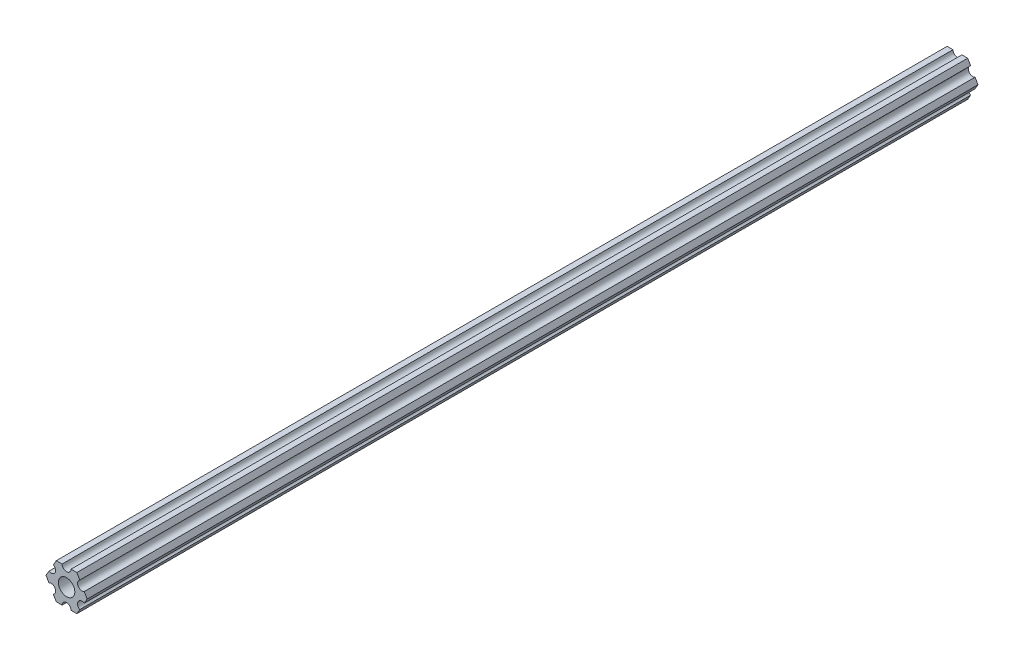
ISO-10303-21;
HEADER;
FILE_DESCRIPTION(('STEP AP214'),'2;1');
FILE_NAME('part.step','',(''),(''),'','','');
FILE_SCHEMA(('AUTOMOTIVE_DESIGN { 1 0 10303 214 1 1 1 1 }'));
ENDSEC;
DATA;
#1=APPLICATION_CONTEXT('core data for automotive mechanical design processes');
#2=APPLICATION_PROTOCOL_DEFINITION('international standard','automotive_design',2000,#1);
#3=PRODUCT_CONTEXT('',#1,'mechanical');
#4=PRODUCT('Part','Part','',(#3));
#5=PRODUCT_RELATED_PRODUCT_CATEGORY('part','',(#4));
#6=PRODUCT_DEFINITION_FORMATION('','',#4);
#7=PRODUCT_DEFINITION_CONTEXT('part definition',#1,'design');
#8=PRODUCT_DEFINITION('design','',#6,#7);
#9=PRODUCT_DEFINITION_SHAPE('','',#8);
#10=(LENGTH_UNIT() NAMED_UNIT(*) SI_UNIT(.MILLI.,.METRE.));
#11=(NAMED_UNIT(*) PLANE_ANGLE_UNIT() SI_UNIT($,.RADIAN.));
#12=(NAMED_UNIT(*) SI_UNIT($,.STERADIAN.) SOLID_ANGLE_UNIT());
#13=UNCERTAINTY_MEASURE_WITH_UNIT(LENGTH_MEASURE(1.E-05),#10,'distance_accuracy_value','');
#14=(GEOMETRIC_REPRESENTATION_CONTEXT(3) GLOBAL_UNCERTAINTY_ASSIGNED_CONTEXT((#13)) GLOBAL_UNIT_ASSIGNED_CONTEXT((#10,
#11,#12)) REPRESENTATION_CONTEXT('',''));
#15=CARTESIAN_POINT('',(0.,0.,0.));
#16=DIRECTION('',(0.,0.,1.));
#17=DIRECTION('',(1.,0.,0.));
#18=AXIS2_PLACEMENT_3D('',#15,#16,#17);
#19=CARTESIAN_POINT('',(6.29301142309098,-1.80018429024546,85.725));
#20=DIRECTION('',(-0.866025434075723,0.499999947533953,0.));
#21=DIRECTION('',(0.,0.,1.));
#22=AXIS2_PLACEMENT_3D('',#19,#20,#21);
#23=PLANE('',#22);
#24=DIRECTION('',(0.,0.,1.));
#25=VECTOR('',#24,1.);
#26=CARTESIAN_POINT('',(7.33234841870827,4.44212519169686E-07,85.725));
#27=LINE('',#26,#25);
#28=CARTESIAN_POINT('',(7.33234841870826,4.44212518961143E-07,-231.775));
#29=VERTEX_POINT('',#28);
#30=CARTESIAN_POINT('',(7.33234841870826,4.44212519315656E-07,85.725));
#31=VERTEX_POINT('',#30);
#32=EDGE_CURVE('E11',#29,#31,#27,.T.);
#33=ORIENTED_EDGE('',*,*,#32,.T.);
#34=DIRECTION('',(0.499999947533953,0.866025434075723,0.));
#35=VECTOR('',#34,1.);
#36=CARTESIAN_POINT('',(6.29301142309098,-1.80018429024546,85.725));
#37=LINE('',#36,#35);
#38=CARTESIAN_POINT('',(6.29301142309098,-1.80018429024546,85.725));
#39=VERTEX_POINT('',#38);
#40=EDGE_CURVE('E301',#39,#31,#37,.T.);
#41=ORIENTED_EDGE('',*,*,#40,.F.);
#42=DIRECTION('',(0.,0.,-1.));
#43=VECTOR('',#42,1.);
#44=CARTESIAN_POINT('',(6.29301142309098,-1.80018429024546,85.725));
#45=LINE('',#44,#43);
#46=CARTESIAN_POINT('',(6.29301142309098,-1.80018429024546,-231.775));
#47=VERTEX_POINT('',#46);
#48=EDGE_CURVE('E300',#39,#47,#45,.T.);
#49=ORIENTED_EDGE('',*,*,#48,.T.);
#50=DIRECTION('',(-0.499999947533953,-0.866025434075723,0.));
#51=VECTOR('',#50,1.);
#52=CARTESIAN_POINT('',(6.29301142309098,-1.80018429024546,-231.775));
#53=LINE('',#52,#51);
#54=EDGE_CURVE('E219',#29,#47,#53,.T.);
#55=ORIENTED_EDGE('',*,*,#54,.F.);
#56=EDGE_LOOP('',(#33,#41,#49,#55));
#57=FACE_BOUND('',#56,.T.);
#58=ADVANCED_FACE('F51',(#57),#23,.F.);
#59=CARTESIAN_POINT('',(7.33234841870827,4.44212519169686E-07,85.725));
#60=DIRECTION('',(-0.866025373493145,-0.500000052466057,0.));
#61=DIRECTION('',(-0.500000052466057,0.866025373493145,0.));
#62=AXIS2_PLACEMENT_3D('',#59,#60,#61);
#63=PLANE('',#62);
#64=DIRECTION('',(0.,0.,1.));
#65=VECTOR('',#64,1.);
#66=CARTESIAN_POINT('',(6.29301120497139,1.80018505273894,85.725));
#67=LINE('',#66,#65);
#68=CARTESIAN_POINT('',(6.29301120497139,1.80018505273894,-231.775));
#69=VERTEX_POINT('',#68);
#70=CARTESIAN_POINT('',(6.29301120497139,1.80018505273894,85.725));
#71=VERTEX_POINT('',#70);
#72=EDGE_CURVE('E59',#69,#71,#67,.T.);
#73=ORIENTED_EDGE('',*,*,#72,.T.);
#74=DIRECTION('',(-0.500000052466057,0.866025373493145,0.));
#75=VECTOR('',#74,1.);
#76=CARTESIAN_POINT('',(7.33234841870827,4.44212519198906E-07,85.725));
#77=LINE('',#76,#75);
#78=EDGE_CURVE('E305',#31,#71,#77,.T.);
#79=ORIENTED_EDGE('',*,*,#78,.F.);
#80=ORIENTED_EDGE('',*,*,#32,.F.);
#81=DIRECTION('',(0.500000052466055,-0.866025373493145,0.));
#82=VECTOR('',#81,1.);
#83=CARTESIAN_POINT('',(7.33234841870826,4.44212518961143E-07,-231.775));
#84=LINE('',#83,#82);
#85=EDGE_CURVE('E213',#69,#29,#84,.T.);
#86=ORIENTED_EDGE('',*,*,#85,.F.);
#87=EDGE_LOOP('',(#73,#79,#80,#86));
#88=FACE_BOUND('',#87,.T.);
#89=ADVANCED_FACE('F214',(#88),#63,.F.);
#90=CARTESIAN_POINT('',(4.70551103839172,4.54981561357972,85.725));
#91=DIRECTION('',(-0.866025373493151,-0.500000052466046,0.));
#92=DIRECTION('',(-0.500000052466046,0.866025373493151,0.));
#93=AXIS2_PLACEMENT_3D('',#90,#91,#92);
#94=PLANE('',#93);
#95=DIRECTION('',(0.,0.,1.));
#96=VECTOR('',#95,1.);
#97=CARTESIAN_POINT('',(3.66617382465481,6.35000022210627,85.725));
#98=LINE('',#97,#96);
#99=CARTESIAN_POINT('',(3.66617382465481,6.35000022210627,-231.775));
#100=VERTEX_POINT('',#99);
#101=CARTESIAN_POINT('',(3.66617382465481,6.35000022210627,85.725));
#102=VERTEX_POINT('',#101);
#103=EDGE_CURVE('E211',#100,#102,#98,.T.);
#104=ORIENTED_EDGE('',*,*,#103,.T.);
#105=DIRECTION('',(-0.500000052466046,0.866025373493151,0.));
#106=VECTOR('',#105,1.);
#107=CARTESIAN_POINT('',(4.70551103839172,4.54981561357972,85.725));
#108=LINE('',#107,#106);
#109=CARTESIAN_POINT('',(4.70551103839172,4.54981561357972,85.725));
#110=VERTEX_POINT('',#109);
#111=EDGE_CURVE('E336',#110,#102,#108,.T.);
#112=ORIENTED_EDGE('',*,*,#111,.F.);
#113=DIRECTION('',(0.,0.,1.));
#114=VECTOR('',#113,1.);
#115=CARTESIAN_POINT('',(4.70551103839172,4.54981561357972,85.725));
#116=LINE('',#115,#114);
#117=CARTESIAN_POINT('',(4.70551103839172,4.54981561357972,-231.775));
#118=VERTEX_POINT('',#117);
#119=EDGE_CURVE('E299',#118,#110,#116,.T.);
#120=ORIENTED_EDGE('',*,*,#119,.F.);
#121=DIRECTION('',(0.500000052466045,-0.866025373493151,0.));
#122=VECTOR('',#121,1.);
#123=CARTESIAN_POINT('',(4.70551103839172,4.54981561357972,-231.775));
#124=LINE('',#123,#122);
#125=EDGE_CURVE('E225',#100,#118,#124,.T.);
#126=ORIENTED_EDGE('',*,*,#125,.F.);
#127=EDGE_LOOP('',(#104,#112,#120,#126));
#128=FACE_BOUND('',#127,.T.);
#129=ADVANCED_FACE('F412',(#128),#94,.F.);
#130=CARTESIAN_POINT('',(3.66617382465481,6.35000022210627,85.725));
#131=DIRECTION('',(6.05825850611185E-08,-1.,0.));
#132=DIRECTION('',(0.,0.,-1.));
#133=AXIS2_PLACEMENT_3D('',#130,#131,#132);
#134=PLANE('',#133);
#135=DIRECTION('',(0.,0.,1.));
#136=VECTOR('',#135,1.);
#137=CARTESIAN_POINT('',(1.58749961530074,6.35000009617482,85.725));
#138=LINE('',#137,#136);
#139=CARTESIAN_POINT('',(1.58749961530073,6.35000015914054,-231.775));
#140=VERTEX_POINT('',#139);
#141=CARTESIAN_POINT('',(1.58749961530073,6.35000015914054,85.725));
#142=VERTEX_POINT('',#141);
#143=EDGE_CURVE('E333',#140,#142,#138,.T.);
#144=ORIENTED_EDGE('',*,*,#143,.T.);
#145=DIRECTION('',(-1.,0.,0.));
#146=VECTOR('',#145,1.);
#147=CARTESIAN_POINT('',(5.49926112168156,6.35000022210627,85.725));
#148=LINE('',#147,#146);
#149=EDGE_CURVE('E340',#102,#142,#148,.T.);
#150=ORIENTED_EDGE('',*,*,#149,.F.);
#151=ORIENTED_EDGE('',*,*,#103,.F.);
#152=DIRECTION('',(1.,3.02912931564594E-08,0.));
#153=VECTOR('',#152,1.);
#154=CARTESIAN_POINT('',(3.66617382465481,6.35000022210627,-231.775));
#155=LINE('',#154,#153);
#156=EDGE_CURVE('E287',#140,#100,#155,.T.);
#157=ORIENTED_EDGE('',*,*,#156,.F.);
#158=EDGE_LOOP('',(#144,#150,#151,#157));
#159=FACE_BOUND('',#158,.T.);
#160=ADVANCED_FACE('F415',(#159),#134,.F.);
#161=CARTESIAN_POINT('',(-3.84699260060323E-07,6.35,85.725));
#162=DIRECTION('',(0.,0.,-1.));
#163=DIRECTION('',(-1.,0.,0.));
#164=AXIS2_PLACEMENT_3D('',#161,#162,#163);
#165=CYLINDRICAL_SURFACE('',#164,1.5875);
#166=DIRECTION('',(0.,0.,1.));
#167=VECTOR('',#166,1.);
#168=CARTESIAN_POINT('',(-1.58750038469926,6.34999990382518,85.725));
#169=LINE('',#168,#167);
#170=CARTESIAN_POINT('',(-1.58750038469926,6.34999990382519,-231.775));
#171=VERTEX_POINT('',#170);
#172=CARTESIAN_POINT('',(-1.58750038469926,6.34999990382519,85.725));
#173=VERTEX_POINT('',#172);
#174=EDGE_CURVE('E330',#171,#173,#169,.T.);
#175=ORIENTED_EDGE('',*,*,#174,.T.);
#176=CARTESIAN_POINT('',(-3.84699260060323E-07,6.35,85.725));
#177=DIRECTION('',(0.,0.,-1.));
#178=DIRECTION('',(-1.,0.,0.));
#179=AXIS2_PLACEMENT_3D('',#176,#177,#178);
#180=CIRCLE('',#179,1.5875);
#181=EDGE_CURVE('E344',#142,#173,#180,.T.);
#182=ORIENTED_EDGE('',*,*,#181,.F.);
#183=ORIENTED_EDGE('',*,*,#143,.F.);
#184=CARTESIAN_POINT('',(-3.84699260060323E-07,6.35,-231.775));
#185=DIRECTION('',(0.,0.,1.));
#186=DIRECTION('',(-1.,0.,0.));
#187=AXIS2_PLACEMENT_3D('',#184,#185,#186);
#188=CIRCLE('',#187,1.5875);
#189=EDGE_CURVE('E283',#171,#140,#188,.T.);
#190=ORIENTED_EDGE('',*,*,#189,.F.);
#191=EDGE_LOOP('',(#175,#182,#183,#190));
#192=FACE_BOUND('',#191,.T.);
#193=ADVANCED_FACE('F464',(#192),#165,.F.);
#194=CARTESIAN_POINT('',(-1.58750038469926,6.34999990382518,85.725));
#195=DIRECTION('',(6.05825963273174E-08,-1.,0.));
#196=DIRECTION('',(0.,0.,-1.));
#197=AXIS2_PLACEMENT_3D('',#194,#195,#196);
#198=PLANE('',#197);
#199=DIRECTION('',(0.,0.,1.));
#200=VECTOR('',#199,1.);
#201=CARTESIAN_POINT('',(-3.66617459405349,6.3499997778937,85.725));
#202=LINE('',#201,#200);
#203=CARTESIAN_POINT('',(-3.66617454558244,6.34999986184803,-231.775));
#204=VERTEX_POINT('',#203);
#205=CARTESIAN_POINT('',(-3.66617454558244,6.34999986184803,85.725));
#206=VERTEX_POINT('',#205);
#207=EDGE_CURVE('E323',#204,#206,#202,.T.);
#208=ORIENTED_EDGE('',*,*,#207,.T.);
#209=DIRECTION('',(-1.,0.,0.));
#210=VECTOR('',#209,1.);
#211=CARTESIAN_POINT('',(5.49926112168156,6.34999990382519,85.725));
#212=LINE('',#211,#210);
#213=EDGE_CURVE('E348',#173,#206,#212,.T.);
#214=ORIENTED_EDGE('',*,*,#213,.F.);
#215=ORIENTED_EDGE('',*,*,#174,.F.);
#216=DIRECTION('',(1.,2.0194198968488E-08,0.));
#217=VECTOR('',#216,1.);
#218=CARTESIAN_POINT('',(-1.58750038469926,6.34999990382519,-231.775));
#219=LINE('',#218,#217);
#220=EDGE_CURVE('E279',#204,#171,#219,.T.);
#221=ORIENTED_EDGE('',*,*,#220,.F.);
#222=EDGE_LOOP('',(#208,#214,#215,#221));
#223=FACE_BOUND('',#222,.T.);
#224=ADVANCED_FACE('F461',(#223),#198,.F.);
#225=CARTESIAN_POINT('',(-3.66617459405349,6.3499997778937,85.725));
#226=DIRECTION('',(0.866025434075729,-0.499999947533942,0.));
#227=DIRECTION('',(0.,0.,-1.));
#228=AXIS2_PLACEMENT_3D('',#225,#226,#227);
#229=PLANE('',#228);
#230=DIRECTION('',(0.,0.,1.));
#231=VECTOR('',#230,1.);
#232=CARTESIAN_POINT('',(-4.70551158967065,4.54981504343587,85.725));
#233=LINE('',#232,#231);
#234=CARTESIAN_POINT('',(-4.70551158967065,4.54981504343587,-231.775));
#235=VERTEX_POINT('',#234);
#236=CARTESIAN_POINT('',(-4.70551158967065,4.54981504343587,85.725));
#237=VERTEX_POINT('',#236);
#238=EDGE_CURVE('E320',#235,#237,#233,.T.);
#239=ORIENTED_EDGE('',*,*,#238,.T.);
#240=DIRECTION('',(-0.499999947533943,-0.866025434075729,0.));
#241=VECTOR('',#240,1.);
#242=CARTESIAN_POINT('',(-3.66617459405349,6.3499997778937,85.725));
#243=LINE('',#242,#241);
#244=EDGE_CURVE('E352',#206,#237,#243,.T.);
#245=ORIENTED_EDGE('',*,*,#244,.F.);
#246=ORIENTED_EDGE('',*,*,#207,.F.);
#247=DIRECTION('',(0.499999947533939,0.866025434075731,0.));
#248=VECTOR('',#247,1.);
#249=CARTESIAN_POINT('',(-3.66617454558244,6.34999986184803,-231.775));
#250=LINE('',#249,#248);
#251=EDGE_CURVE('E275',#235,#204,#250,.T.);
#252=ORIENTED_EDGE('',*,*,#251,.F.);
#253=EDGE_LOOP('',(#239,#245,#246,#252));
#254=FACE_BOUND('',#253,.T.);
#255=ADVANCED_FACE('F457',(#254),#229,.F.);
#256=CARTESIAN_POINT('',(-5.49926150638082,3.17499966684067,85.725));
#257=DIRECTION('',(0.,0.,-1.));
#258=DIRECTION('',(-1.,0.,0.));
#259=AXIS2_PLACEMENT_3D('',#256,#257,#258);
#260=CYLINDRICAL_SURFACE('',#259,1.5875);
#261=DIRECTION('',(0.,0.,1.));
#262=VECTOR('',#261,1.);
#263=CARTESIAN_POINT('',(-6.29301142309098,1.80018429024547,85.725));
#264=LINE('',#263,#262);
#265=CARTESIAN_POINT('',(-6.29301142309098,1.80018429024546,-231.775));
#266=VERTEX_POINT('',#265);
#267=CARTESIAN_POINT('',(-6.29301142309098,1.80018429024547,85.725));
#268=VERTEX_POINT('',#267);
#269=EDGE_CURVE('E324',#266,#268,#264,.T.);
#270=ORIENTED_EDGE('',*,*,#269,.T.);
#271=CARTESIAN_POINT('',(-5.49926150638082,3.17499966684067,85.725));
#272=DIRECTION('',(0.,0.,-1.));
#273=DIRECTION('',(-1.,0.,0.));
#274=AXIS2_PLACEMENT_3D('',#271,#272,#273);
#275=CIRCLE('',#274,1.5875);
#276=EDGE_CURVE('E362',#237,#268,#275,.T.);
#277=ORIENTED_EDGE('',*,*,#276,.F.);
#278=ORIENTED_EDGE('',*,*,#238,.F.);
#279=CARTESIAN_POINT('',(-5.49926150638082,3.17499966684067,-231.775));
#280=DIRECTION('',(0.,0.,1.));
#281=DIRECTION('',(-1.,0.,0.));
#282=AXIS2_PLACEMENT_3D('',#279,#280,#281);
#283=CIRCLE('',#282,1.5875);
#284=EDGE_CURVE('E271',#266,#235,#283,.T.);
#285=ORIENTED_EDGE('',*,*,#284,.F.);
#286=EDGE_LOOP('',(#270,#277,#278,#285));
#287=FACE_BOUND('',#286,.T.);
#288=ADVANCED_FACE('F453',(#287),#260,.F.);
#289=CARTESIAN_POINT('',(-6.29301142309098,1.80018429024547,85.725));
#290=DIRECTION('',(0.866025434075724,-0.499999947533952,0.));
#291=DIRECTION('',(0.,0.,-1.));
#292=AXIS2_PLACEMENT_3D('',#289,#290,#291);
#293=PLANE('',#292);
#294=DIRECTION('',(0.,0.,1.));
#295=VECTOR('',#294,1.);
#296=CARTESIAN_POINT('',(-7.33234841870827,-4.44212523790841E-07,85.725));
#297=LINE('',#296,#295);
#298=CARTESIAN_POINT('',(-7.33234841870826,-4.44212524036367E-07,-231.775));
#299=VERTEX_POINT('',#298);
#300=CARTESIAN_POINT('',(-7.33234841870826,-4.44212524036367E-07,85.725));
#301=VERTEX_POINT('',#300);
#302=EDGE_CURVE('E317',#299,#301,#297,.T.);
#303=ORIENTED_EDGE('',*,*,#302,.T.);
#304=DIRECTION('',(-0.499999947533952,-0.866025434075724,0.));
#305=VECTOR('',#304,1.);
#306=CARTESIAN_POINT('',(-6.29301142309098,1.80018429024547,85.725));
#307=LINE('',#306,#305);
#308=EDGE_CURVE('E358',#268,#301,#307,.T.);
#309=ORIENTED_EDGE('',*,*,#308,.F.);
#310=ORIENTED_EDGE('',*,*,#269,.F.);
#311=DIRECTION('',(0.499999947533951,0.866025434075724,0.));
#312=VECTOR('',#311,1.);
#313=CARTESIAN_POINT('',(-6.29301142309098,1.80018429024547,-231.775));
#314=LINE('',#313,#312);
#315=EDGE_CURVE('E267',#299,#266,#314,.T.);
#316=ORIENTED_EDGE('',*,*,#315,.F.);
#317=EDGE_LOOP('',(#303,#309,#310,#316));
#318=FACE_BOUND('',#317,.T.);
#319=ADVANCED_FACE('F449',(#318),#293,.F.);
#320=CARTESIAN_POINT('',(-7.33234841870827,-4.44212523790841E-07,85.725));
#321=DIRECTION('',(0.866025373493151,0.500000052466045,0.));
#322=DIRECTION('',(0.,0.,-1.));
#323=AXIS2_PLACEMENT_3D('',#320,#321,#322);
#324=PLANE('',#323);
#325=DIRECTION('',(0.,0.,1.));
#326=VECTOR('',#325,1.);
#327=CARTESIAN_POINT('',(-6.29301120497141,-1.80018505273897,85.725));
#328=LINE('',#327,#326);
#329=CARTESIAN_POINT('',(-6.29301120497141,-1.80018505273897,-231.775));
#330=VERTEX_POINT('',#329);
#331=CARTESIAN_POINT('',(-6.29301120497141,-1.80018505273897,85.725));
#332=VERTEX_POINT('',#331);
#333=EDGE_CURVE('E310',#330,#332,#328,.T.);
#334=ORIENTED_EDGE('',*,*,#333,.T.);
#335=DIRECTION('',(0.500000052466045,-0.866025373493151,0.));
#336=VECTOR('',#335,1.);
#337=CARTESIAN_POINT('',(-7.33234841870827,-4.44212523969395E-07,85.725));
#338=LINE('',#337,#336);
#339=EDGE_CURVE('E353',#301,#332,#338,.T.);
#340=ORIENTED_EDGE('',*,*,#339,.F.);
#341=ORIENTED_EDGE('',*,*,#302,.F.);
#342=DIRECTION('',(-0.500000052466045,0.866025373493152,0.));
#343=VECTOR('',#342,1.);
#344=CARTESIAN_POINT('',(-7.33234841870826,-4.44212524036367E-07,-231.775));
#345=LINE('',#344,#343);
#346=EDGE_CURVE('E263',#330,#299,#345,.T.);
#347=ORIENTED_EDGE('',*,*,#346,.F.);
#348=EDGE_LOOP('',(#334,#340,#341,#347));
#349=FACE_BOUND('',#348,.T.);
#350=ADVANCED_FACE('F445',(#349),#324,.F.);
#351=CARTESIAN_POINT('',(-5.49926112168156,-3.17500033315934,85.725));
#352=DIRECTION('',(0.,0.,-1.));
#353=DIRECTION('',(-1.,0.,0.));
#354=AXIS2_PLACEMENT_3D('',#351,#352,#353);
#355=CYLINDRICAL_SURFACE('',#354,1.5875);
#356=DIRECTION('',(0.,0.,1.));
#357=VECTOR('',#356,1.);
#358=CARTESIAN_POINT('',(-4.70551103839172,-4.54981561357972,85.725));
#359=LINE('',#358,#357);
#360=CARTESIAN_POINT('',(-4.70551103839172,-4.54981561357972,-231.775));
#361=VERTEX_POINT('',#360);
#362=CARTESIAN_POINT('',(-4.70551103839172,-4.54981561357972,85.725));
#363=VERTEX_POINT('',#362);
#364=EDGE_CURVE('E307',#361,#363,#359,.T.);
#365=ORIENTED_EDGE('',*,*,#364,.T.);
#366=CARTESIAN_POINT('',(-5.49926112168156,-3.17500033315934,85.725));
#367=DIRECTION('',(0.,0.,-1.));
#368=DIRECTION('',(-1.,0.,0.));
#369=AXIS2_PLACEMENT_3D('',#366,#367,#368);
#370=CIRCLE('',#369,1.5875);
#371=EDGE_CURVE('E357',#332,#363,#370,.T.);
#372=ORIENTED_EDGE('',*,*,#371,.F.);
#373=ORIENTED_EDGE('',*,*,#333,.F.);
#374=CARTESIAN_POINT('',(-5.49926112168156,-3.17500033315934,-231.775));
#375=DIRECTION('',(0.,0.,1.));
#376=DIRECTION('',(-1.,0.,0.));
#377=AXIS2_PLACEMENT_3D('',#374,#375,#376);
#378=CIRCLE('',#377,1.5875);
#379=EDGE_CURVE('E259',#361,#330,#378,.T.);
#380=ORIENTED_EDGE('',*,*,#379,.F.);
#381=EDGE_LOOP('',(#365,#372,#373,#380));
#382=FACE_BOUND('',#381,.T.);
#383=ADVANCED_FACE('F441',(#382),#355,.F.);
#384=CARTESIAN_POINT('',(-4.70551103839172,-4.54981561357972,85.725));
#385=DIRECTION('',(0.866025373493152,0.500000052466045,0.));
#386=DIRECTION('',(0.,0.,-1.));
#387=AXIS2_PLACEMENT_3D('',#384,#385,#386);
#388=PLANE('',#387);
#389=DIRECTION('',(0.,0.,1.));
#390=VECTOR('',#389,1.);
#391=CARTESIAN_POINT('',(-3.66617382465481,-6.35000022210628,85.725));
#392=LINE('',#391,#390);
#393=CARTESIAN_POINT('',(-3.66617382465481,-6.35000022210628,-231.775));
#394=VERTEX_POINT('',#393);
#395=CARTESIAN_POINT('',(-3.66617382465481,-6.35000022210628,85.725));
#396=VERTEX_POINT('',#395);
#397=EDGE_CURVE('E311',#394,#396,#392,.T.);
#398=ORIENTED_EDGE('',*,*,#397,.T.);
#399=DIRECTION('',(0.500000052466045,-0.866025373493151,0.));
#400=VECTOR('',#399,1.);
#401=CARTESIAN_POINT('',(-4.70551103839172,-4.54981561357972,85.725));
#402=LINE('',#401,#400);
#403=EDGE_CURVE('E372',#363,#396,#402,.T.);
#404=ORIENTED_EDGE('',*,*,#403,.F.);
#405=ORIENTED_EDGE('',*,*,#364,.F.);
#406=DIRECTION('',(-0.500000052466043,0.866025373493152,0.));
#407=VECTOR('',#406,1.);
#408=CARTESIAN_POINT('',(-4.70551103839172,-4.54981561357972,-231.775));
#409=LINE('',#408,#407);
#410=EDGE_CURVE('E255',#394,#361,#409,.T.);
#411=ORIENTED_EDGE('',*,*,#410,.F.);
#412=EDGE_LOOP('',(#398,#404,#405,#411));
#413=FACE_BOUND('',#412,.T.);
#414=ADVANCED_FACE('F437',(#413),#388,.F.);
#415=CARTESIAN_POINT('',(-3.66617382465481,-6.35000022210628,85.725));
#416=DIRECTION('',(-6.05825854783851E-08,1.,0.));
#417=DIRECTION('',(0.,0.,1.));
#418=AXIS2_PLACEMENT_3D('',#415,#416,#417);
#419=PLANE('',#418);
#420=DIRECTION('',(0.,0.,1.));
#421=VECTOR('',#420,1.);
#422=CARTESIAN_POINT('',(-1.58749961530074,-6.35,85.725));
#423=LINE('',#422,#421);
#424=CARTESIAN_POINT('',(-1.58749961530073,-6.35000011105314,-231.775));
#425=VERTEX_POINT('',#424);
#426=CARTESIAN_POINT('',(-1.58749961530073,-6.35000011105314,85.725));
#427=VERTEX_POINT('',#426);
#428=EDGE_CURVE('E82',#425,#427,#423,.T.);
#429=ORIENTED_EDGE('',*,*,#428,.T.);
#430=DIRECTION('',(1.,0.,0.));
#431=VECTOR('',#430,1.);
#432=CARTESIAN_POINT('',(5.49926112168156,-6.35000022210628,85.725));
#433=LINE('',#432,#431);
#434=EDGE_CURVE('E376',#396,#427,#433,.T.);
#435=ORIENTED_EDGE('',*,*,#434,.F.);
#436=ORIENTED_EDGE('',*,*,#397,.F.);
#437=DIRECTION('',(-0.999999999999999,-5.34249856349036E-08,0.));
#438=VECTOR('',#437,1.);
#439=CARTESIAN_POINT('',(-3.66617382465481,-6.35000022210628,-231.775));
#440=LINE('',#439,#438);
#441=EDGE_CURVE('E251',#425,#394,#440,.T.);
#442=ORIENTED_EDGE('',*,*,#441,.F.);
#443=EDGE_LOOP('',(#429,#435,#436,#442));
#444=FACE_BOUND('',#443,.T.);
#445=ADVANCED_FACE('F434',(#444),#419,.F.);
#446=CARTESIAN_POINT('',(3.8469926204343E-07,-6.35,85.725));
#447=DIRECTION('',(0.,0.,-1.));
#448=DIRECTION('',(-1.,0.,0.));
#449=AXIS2_PLACEMENT_3D('',#446,#447,#448);
#450=CYLINDRICAL_SURFACE('',#449,1.5875);
#451=DIRECTION('',(0.,0.,1.));
#452=VECTOR('',#451,1.);
#453=CARTESIAN_POINT('',(1.58750038469926,-6.34999990382518,85.725));
#454=LINE('',#453,#452);
#455=CARTESIAN_POINT('',(1.58750038469926,-6.34999990382519,-231.775));
#456=VERTEX_POINT('',#455);
#457=CARTESIAN_POINT('',(1.58750038469926,-6.34999990382519,85.725));
#458=VERTEX_POINT('',#457);
#459=EDGE_CURVE('E71',#456,#458,#454,.T.);
#460=ORIENTED_EDGE('',*,*,#459,.T.);
#461=CARTESIAN_POINT('',(3.8469926204343E-07,-6.35,85.725));
#462=DIRECTION('',(0.,0.,-1.));
#463=DIRECTION('',(-1.,0.,0.));
#464=AXIS2_PLACEMENT_3D('',#461,#462,#463);
#465=CIRCLE('',#464,1.5875);
#466=EDGE_CURVE('E380',#427,#458,#465,.T.);
#467=ORIENTED_EDGE('',*,*,#466,.F.);
#468=ORIENTED_EDGE('',*,*,#428,.F.);
#469=CARTESIAN_POINT('',(3.8469926204343E-07,-6.35,-231.775));
#470=DIRECTION('',(0.,0.,1.));
#471=DIRECTION('',(-1.,0.,0.));
#472=AXIS2_PLACEMENT_3D('',#469,#470,#471);
#473=CIRCLE('',#472,1.5875);
#474=EDGE_CURVE('E247',#456,#425,#473,.T.);
#475=ORIENTED_EDGE('',*,*,#474,.F.);
#476=EDGE_LOOP('',(#460,#467,#468,#475));
#477=FACE_BOUND('',#476,.T.);
#478=ADVANCED_FACE('F432',(#477),#450,.F.);
#479=CARTESIAN_POINT('',(1.58750038469926,-6.34999990382518,85.725));
#480=DIRECTION('',(-6.05825721258438E-08,1.,0.));
#481=DIRECTION('',(0.,0.,1.));
#482=AXIS2_PLACEMENT_3D('',#479,#480,#481);
#483=PLANE('',#482);
#484=DIRECTION('',(0.,0.,1.));
#485=VECTOR('',#484,1.);
#486=CARTESIAN_POINT('',(3.66617459405346,-6.34999977789375,85.725));
#487=LINE('',#486,#485);
#488=CARTESIAN_POINT('',(3.66617454558244,-6.34999986184804,-231.775));
#489=VERTEX_POINT('',#488);
#490=CARTESIAN_POINT('',(3.66617454558244,-6.34999986184804,85.725));
#491=VERTEX_POINT('',#490);
#492=EDGE_CURVE('E381',#489,#491,#487,.T.);
#493=ORIENTED_EDGE('',*,*,#492,.T.);
#494=DIRECTION('',(1.,0.,0.));
#495=VECTOR('',#494,1.);
#496=CARTESIAN_POINT('',(5.49926112168156,-6.34999990382519,85.725));
#497=LINE('',#496,#495);
#498=EDGE_CURVE('E388',#458,#491,#497,.T.);
#499=ORIENTED_EDGE('',*,*,#498,.F.);
#500=ORIENTED_EDGE('',*,*,#459,.F.);
#501=DIRECTION('',(-1.,-2.01941943785532E-08,0.));
#502=VECTOR('',#501,1.);
#503=CARTESIAN_POINT('',(1.58750038469926,-6.34999990382519,-231.775));
#504=LINE('',#503,#502);
#505=EDGE_CURVE('E243',#489,#456,#504,.T.);
#506=ORIENTED_EDGE('',*,*,#505,.F.);
#507=EDGE_LOOP('',(#493,#499,#500,#506));
#508=FACE_BOUND('',#507,.T.);
#509=ADVANCED_FACE('F431',(#508),#483,.F.);
#510=CARTESIAN_POINT('',(3.66617459405346,-6.34999977789375,85.725));
#511=DIRECTION('',(-0.86602543407573,0.499999947533941,0.));
#512=DIRECTION('',(0.,0.,1.));
#513=AXIS2_PLACEMENT_3D('',#510,#511,#512);
#514=PLANE('',#513);
#515=DIRECTION('',(0.,0.,-1.));
#516=VECTOR('',#515,1.);
#517=CARTESIAN_POINT('',(4.70551158967065,-4.54981504343587,85.725));
#518=LINE('',#517,#516);
#519=CARTESIAN_POINT('',(4.70551158967065,-4.54981504343587,85.725));
#520=VERTEX_POINT('',#519);
#521=CARTESIAN_POINT('',(4.70551158967065,-4.54981504343587,-231.775));
#522=VERTEX_POINT('',#521);
#523=EDGE_CURVE('E384',#520,#522,#518,.T.);
#524=ORIENTED_EDGE('',*,*,#523,.F.);
#525=DIRECTION('',(0.49999994753394,0.86602543407573,0.));
#526=VECTOR('',#525,1.);
#527=CARTESIAN_POINT('',(3.66617459405346,-6.34999977789376,85.725));
#528=LINE('',#527,#526);
#529=EDGE_CURVE('E306',#491,#520,#528,.T.);
#530=ORIENTED_EDGE('',*,*,#529,.F.);
#531=ORIENTED_EDGE('',*,*,#492,.F.);
#532=DIRECTION('',(-0.499999947533941,-0.86602543407573,0.));
#533=VECTOR('',#532,1.);
#534=CARTESIAN_POINT('',(3.66617454558244,-6.34999986184804,-231.775));
#535=LINE('',#534,#533);
#536=EDGE_CURVE('E239',#522,#489,#535,.T.);
#537=ORIENTED_EDGE('',*,*,#536,.F.);
#538=EDGE_LOOP('',(#524,#530,#531,#537));
#539=FACE_BOUND('',#538,.T.);
#540=ADVANCED_FACE('F428',(#539),#514,.F.);
#541=CARTESIAN_POINT('',(5.49926112168156,3.17500033315934,85.725));
#542=DIRECTION('',(0.,0.,1.));
#543=DIRECTION('',(1.,0.,0.));
#544=AXIS2_PLACEMENT_3D('',#541,#542,#543);
#545=PLANE('',#544);
#546=CARTESIAN_POINT('',(0.,0.,85.725));
#547=DIRECTION('',(0.,0.,-1.));
#548=DIRECTION('',(-1.,0.,0.));
#549=AXIS2_PLACEMENT_3D('',#546,#547,#548);
#550=CIRCLE('',#549,2.9337);
#551=CARTESIAN_POINT('',(-2.9337,0.,85.725));
#552=VERTEX_POINT('',#551);
#553=EDGE_CURVE('E292',#552,#552,#550,.T.);
#554=ORIENTED_EDGE('',*,*,#553,.T.);
#555=EDGE_LOOP('',(#554));
#556=FACE_BOUND('',#555,.T.);
#557=ORIENTED_EDGE('',*,*,#529,.T.);
#558=CARTESIAN_POINT('',(5.49926150638082,-3.17499966684067,85.725));
#559=DIRECTION('',(0.,0.,-1.));
#560=DIRECTION('',(-1.,0.,0.));
#561=AXIS2_PLACEMENT_3D('',#558,#559,#560);
#562=CIRCLE('',#561,1.5875);
#563=EDGE_CURVE('E296',#520,#39,#562,.T.);
#564=ORIENTED_EDGE('',*,*,#563,.T.);
#565=ORIENTED_EDGE('',*,*,#40,.T.);
#566=ORIENTED_EDGE('',*,*,#78,.T.);
#567=CARTESIAN_POINT('',(5.49926112168156,3.17500033315934,85.725));
#568=DIRECTION('',(0.,0.,-1.));
#569=DIRECTION('',(-1.,0.,0.));
#570=AXIS2_PLACEMENT_3D('',#567,#568,#569);
#571=CIRCLE('',#570,1.5875);
#572=EDGE_CURVE('E206',#71,#110,#571,.T.);
#573=ORIENTED_EDGE('',*,*,#572,.T.);
#574=ORIENTED_EDGE('',*,*,#111,.T.);
#575=ORIENTED_EDGE('',*,*,#149,.T.);
#576=ORIENTED_EDGE('',*,*,#181,.T.);
#577=ORIENTED_EDGE('',*,*,#213,.T.);
#578=ORIENTED_EDGE('',*,*,#244,.T.);
#579=ORIENTED_EDGE('',*,*,#276,.T.);
#580=ORIENTED_EDGE('',*,*,#308,.T.);
#581=ORIENTED_EDGE('',*,*,#339,.T.);
#582=ORIENTED_EDGE('',*,*,#371,.T.);
#583=ORIENTED_EDGE('',*,*,#403,.T.);
#584=ORIENTED_EDGE('',*,*,#434,.T.);
#585=ORIENTED_EDGE('',*,*,#466,.T.);
#586=ORIENTED_EDGE('',*,*,#498,.T.);
#587=EDGE_LOOP('',(#557,#564,#565,#566,#573,#574,#575,#576,#577,#578,#579,#580,#581,#582,#583,
#584,#585,#586));
#588=FACE_BOUND('',#587,.T.);
#589=ADVANCED_FACE('F418',(#556,#588),#545,.T.);
#590=CARTESIAN_POINT('',(5.49926112168156,3.17500033315934,85.725));
#591=DIRECTION('',(0.,0.,-1.));
#592=DIRECTION('',(-1.,0.,0.));
#593=AXIS2_PLACEMENT_3D('',#590,#591,#592);
#594=CYLINDRICAL_SURFACE('',#593,1.5875);
#595=ORIENTED_EDGE('',*,*,#572,.F.);
#596=ORIENTED_EDGE('',*,*,#72,.F.);
#597=CARTESIAN_POINT('',(5.49926112168156,3.17500033315934,-231.775));
#598=DIRECTION('',(0.,0.,1.));
#599=DIRECTION('',(-1.,0.,0.));
#600=AXIS2_PLACEMENT_3D('',#597,#598,#599);
#601=CIRCLE('',#600,1.5875);
#602=EDGE_CURVE('E203',#118,#69,#601,.T.);
#603=ORIENTED_EDGE('',*,*,#602,.F.);
#604=ORIENTED_EDGE('',*,*,#119,.T.);
#605=EDGE_LOOP('',(#595,#596,#603,#604));
#606=FACE_BOUND('',#605,.T.);
#607=ADVANCED_FACE('F200',(#606),#594,.F.);
#608=CARTESIAN_POINT('',(5.49926150638082,-3.17499966684067,85.725));
#609=DIRECTION('',(0.,0.,-1.));
#610=DIRECTION('',(-1.,0.,0.));
#611=AXIS2_PLACEMENT_3D('',#608,#609,#610);
#612=CYLINDRICAL_SURFACE('',#611,1.5875);
#613=ORIENTED_EDGE('',*,*,#563,.F.);
#614=ORIENTED_EDGE('',*,*,#523,.T.);
#615=CARTESIAN_POINT('',(5.49926150638082,-3.17499966684067,-231.775));
#616=DIRECTION('',(0.,0.,1.));
#617=DIRECTION('',(-1.,0.,0.));
#618=AXIS2_PLACEMENT_3D('',#615,#616,#617);
#619=CIRCLE('',#618,1.5875);
#620=EDGE_CURVE('E235',#47,#522,#619,.T.);
#621=ORIENTED_EDGE('',*,*,#620,.F.);
#622=ORIENTED_EDGE('',*,*,#48,.F.);
#623=EDGE_LOOP('',(#613,#614,#621,#622));
#624=FACE_BOUND('',#623,.T.);
#625=ADVANCED_FACE('F423',(#624),#612,.F.);
#626=CARTESIAN_POINT('',(0.,0.,85.725));
#627=DIRECTION('',(0.,0.,-1.));
#628=DIRECTION('',(-1.,0.,0.));
#629=AXIS2_PLACEMENT_3D('',#626,#627,#628);
#630=CYLINDRICAL_SURFACE('',#629,2.9337);
#631=ORIENTED_EDGE('',*,*,#553,.F.);
#632=EDGE_LOOP('',(#631));
#633=FACE_BOUND('',#632,.T.);
#634=CARTESIAN_POINT('',(0.,0.,-231.775));
#635=DIRECTION('',(0.,0.,-1.));
#636=DIRECTION('',(-1.,0.,0.));
#637=AXIS2_PLACEMENT_3D('',#634,#635,#636);
#638=CIRCLE('',#637,2.9337);
#639=CARTESIAN_POINT('',(-2.9337,0.,-231.775));
#640=VERTEX_POINT('',#639);
#641=EDGE_CURVE('E227',#640,#640,#638,.T.);
#642=ORIENTED_EDGE('',*,*,#641,.T.);
#643=EDGE_LOOP('',(#642));
#644=FACE_BOUND('',#643,.T.);
#645=ADVANCED_FACE('F483',(#633,#644),#630,.F.);
#646=CARTESIAN_POINT('',(5.49926112168156,3.17500033315934,-231.775));
#647=DIRECTION('',(0.,0.,-1.));
#648=DIRECTION('',(-1.,0.,0.));
#649=AXIS2_PLACEMENT_3D('',#646,#647,#648);
#650=PLANE('',#649);
#651=ORIENTED_EDGE('',*,*,#602,.T.);
#652=ORIENTED_EDGE('',*,*,#85,.T.);
#653=ORIENTED_EDGE('',*,*,#54,.T.);
#654=ORIENTED_EDGE('',*,*,#620,.T.);
#655=ORIENTED_EDGE('',*,*,#536,.T.);
#656=ORIENTED_EDGE('',*,*,#505,.T.);
#657=ORIENTED_EDGE('',*,*,#474,.T.);
#658=ORIENTED_EDGE('',*,*,#441,.T.);
#659=ORIENTED_EDGE('',*,*,#410,.T.);
#660=ORIENTED_EDGE('',*,*,#379,.T.);
#661=ORIENTED_EDGE('',*,*,#346,.T.);
#662=ORIENTED_EDGE('',*,*,#315,.T.);
#663=ORIENTED_EDGE('',*,*,#284,.T.);
#664=ORIENTED_EDGE('',*,*,#251,.T.);
#665=ORIENTED_EDGE('',*,*,#220,.T.);
#666=ORIENTED_EDGE('',*,*,#189,.T.);
#667=ORIENTED_EDGE('',*,*,#156,.T.);
#668=ORIENTED_EDGE('',*,*,#125,.T.);
#669=EDGE_LOOP('',(#651,#652,#653,#654,#655,#656,#657,#658,#659,#660,#661,#662,#663,#664,#665,
#666,#667,#668));
#670=FACE_BOUND('',#669,.T.);
#671=ORIENTED_EDGE('',*,*,#641,.F.);
#672=EDGE_LOOP('',(#671));
#673=FACE_BOUND('',#672,.T.);
#674=ADVANCED_FACE('F221',(#670,#673),#650,.T.);
#675=CLOSED_SHELL('',(#58,#89,#129,#160,#193,#224,#255,#288,#319,#350,#383,#414,#445,#478,#509,
#540,#589,#607,#625,#645,#674));
#676=MANIFOLD_SOLID_BREP('B2',#675);
#677=ADVANCED_BREP_SHAPE_REPRESENTATION('',(#18,#676),#14);
#678=SHAPE_DEFINITION_REPRESENTATION(#9,#677);
ENDSEC;
END-ISO-10303-21;
